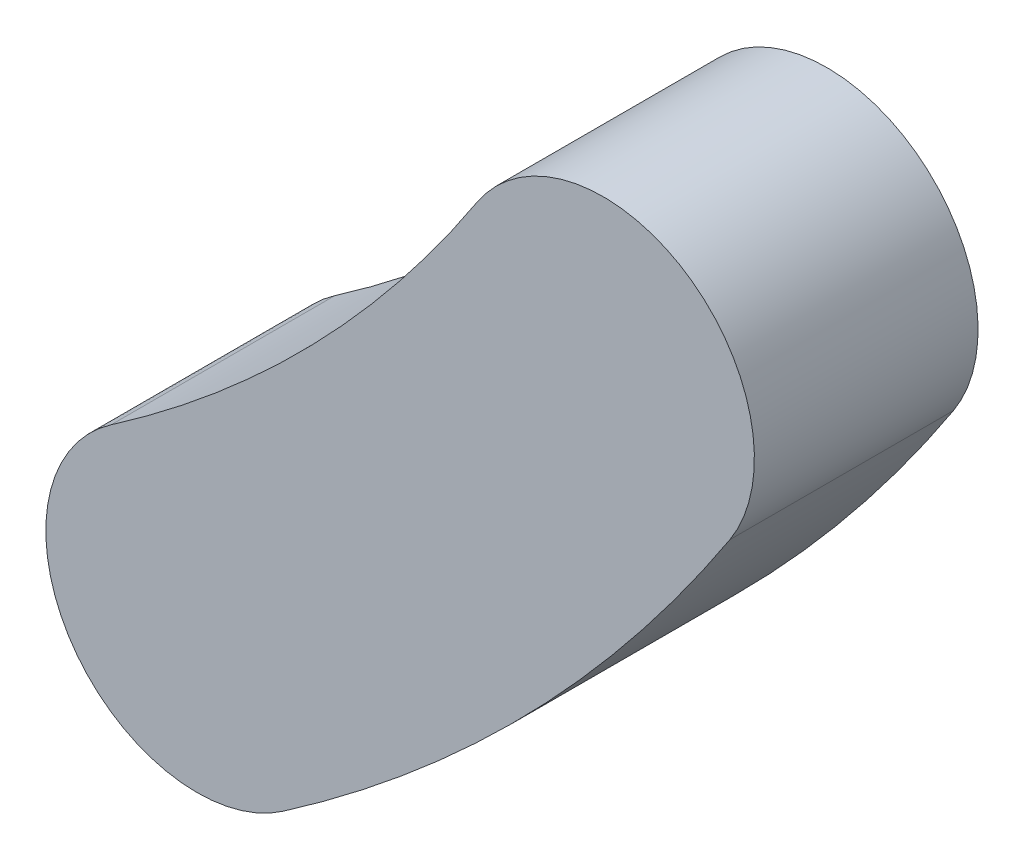
ISO-10303-21;
HEADER;
FILE_DESCRIPTION(('STEP AP214'),'2;1');
FILE_NAME('part.step','',(''),(''),'','','');
FILE_SCHEMA(('AUTOMOTIVE_DESIGN { 1 0 10303 214 1 1 1 1 }'));
ENDSEC;
DATA;
#1=APPLICATION_CONTEXT('core data for automotive mechanical design processes');
#2=APPLICATION_PROTOCOL_DEFINITION('international standard','automotive_design',2000,#1);
#3=PRODUCT_CONTEXT('',#1,'mechanical');
#4=PRODUCT('Part','Part','',(#3));
#5=PRODUCT_RELATED_PRODUCT_CATEGORY('part','',(#4));
#6=PRODUCT_DEFINITION_FORMATION('','',#4);
#7=PRODUCT_DEFINITION_CONTEXT('part definition',#1,'design');
#8=PRODUCT_DEFINITION('design','',#6,#7);
#9=PRODUCT_DEFINITION_SHAPE('','',#8);
#10=(LENGTH_UNIT() NAMED_UNIT(*) SI_UNIT(.MILLI.,.METRE.));
#11=(NAMED_UNIT(*) PLANE_ANGLE_UNIT() SI_UNIT($,.RADIAN.));
#12=(NAMED_UNIT(*) SI_UNIT($,.STERADIAN.) SOLID_ANGLE_UNIT());
#13=UNCERTAINTY_MEASURE_WITH_UNIT(LENGTH_MEASURE(1.E-05),#10,'distance_accuracy_value','');
#14=(GEOMETRIC_REPRESENTATION_CONTEXT(3) GLOBAL_UNCERTAINTY_ASSIGNED_CONTEXT((#13)) GLOBAL_UNIT_ASSIGNED_CONTEXT((#10,
#11,#12)) REPRESENTATION_CONTEXT('',''));
#15=CARTESIAN_POINT('',(0.,0.,0.));
#16=DIRECTION('',(0.,0.,1.));
#17=DIRECTION('',(1.,0.,0.));
#18=AXIS2_PLACEMENT_3D('',#15,#16,#17);
#19=CARTESIAN_POINT('',(96.5590775079883,4.43087548038594,3.));
#20=DIRECTION('',(0.,0.,-1.));
#21=DIRECTION('',(-1.,0.,0.));
#22=AXIS2_PLACEMENT_3D('',#19,#20,#21);
#23=CYLINDRICAL_SURFACE('',#22,2.02785815452427);
#24=CARTESIAN_POINT('',(96.5590775079883,4.43087548038594,0.));
#25=DIRECTION('',(0.,0.,1.));
#26=DIRECTION('',(1.,0.,0.));
#27=AXIS2_PLACEMENT_3D('',#24,#25,#26);
#28=CIRCLE('',#27,2.02785815452427);
#29=CARTESIAN_POINT('',(95.4078998484682,6.10030612916785,0.));
#30=VERTEX_POINT('',#29);
#31=CARTESIAN_POINT('',(97.7102551675084,2.76144483160403,0.));
#32=VERTEX_POINT('',#31);
#33=EDGE_CURVE('E96',#30,#32,#28,.T.);
#34=ORIENTED_EDGE('',*,*,#33,.T.);
#35=DIRECTION('',(0.,0.,-1.));
#36=VECTOR('',#35,1.);
#37=CARTESIAN_POINT('',(97.7102551675084,2.76144483160403,3.));
#38=LINE('',#37,#36);
#39=CARTESIAN_POINT('',(97.7102551675084,2.76144483160403,3.));
#40=VERTEX_POINT('',#39);
#41=EDGE_CURVE('E11',#40,#32,#38,.T.);
#42=ORIENTED_EDGE('',*,*,#41,.F.);
#43=CARTESIAN_POINT('',(96.5590775079883,4.43087548038594,3.));
#44=DIRECTION('',(0.,0.,1.));
#45=DIRECTION('',(1.,0.,0.));
#46=AXIS2_PLACEMENT_3D('',#43,#44,#45);
#47=CIRCLE('',#46,2.02785815452427);
#48=CARTESIAN_POINT('',(95.4078998484682,6.10030612916785,3.));
#49=VERTEX_POINT('',#48);
#50=EDGE_CURVE('E84',#49,#40,#47,.T.);
#51=ORIENTED_EDGE('',*,*,#50,.F.);
#52=DIRECTION('',(0.,0.,-1.));
#53=VECTOR('',#52,1.);
#54=CARTESIAN_POINT('',(95.4078998484682,6.10030612916785,3.));
#55=LINE('',#54,#53);
#56=EDGE_CURVE('E92',#49,#30,#55,.T.);
#57=ORIENTED_EDGE('',*,*,#56,.T.);
#58=EDGE_LOOP('',(#34,#42,#51,#57));
#59=FACE_BOUND('',#58,.T.);
#60=ADVANCED_FACE('F33',(#59),#23,.T.);
#61=CARTESIAN_POINT('',(85.1067875300661,21.0389148475256,3.));
#62=DIRECTION('',(0.,0.,-1.));
#63=DIRECTION('',(-1.,0.,0.));
#64=AXIS2_PLACEMENT_3D('',#61,#62,#63);
#65=CYLINDRICAL_SURFACE('',#64,22.2016509897567);
#66=CARTESIAN_POINT('',(85.1067875300661,21.0389148475256,0.));
#67=DIRECTION('',(0.,0.,1.));
#68=DIRECTION('',(1.,0.,0.));
#69=AXIS2_PLACEMENT_3D('',#66,#67,#68);
#70=CIRCLE('',#69,22.2016509897567);
#71=CARTESIAN_POINT('',(103.705299458729,8.91420203812898,0.));
#72=VERTEX_POINT('',#71);
#73=EDGE_CURVE('E88',#32,#72,#70,.T.);
#74=ORIENTED_EDGE('',*,*,#73,.T.);
#75=DIRECTION('',(0.,0.,-1.));
#76=VECTOR('',#75,1.);
#77=CARTESIAN_POINT('',(103.705299458729,8.91420203812898,3.));
#78=LINE('',#77,#76);
#79=CARTESIAN_POINT('',(103.705299458729,8.91420203812898,3.));
#80=VERTEX_POINT('',#79);
#81=EDGE_CURVE('E41',#80,#72,#78,.T.);
#82=ORIENTED_EDGE('',*,*,#81,.F.);
#83=CARTESIAN_POINT('',(85.1067875300661,21.0389148475256,3.));
#84=DIRECTION('',(0.,0.,1.));
#85=DIRECTION('',(1.,0.,0.));
#86=AXIS2_PLACEMENT_3D('',#83,#84,#85);
#87=CIRCLE('',#86,22.2016509897567);
#88=EDGE_CURVE('E79',#40,#80,#87,.T.);
#89=ORIENTED_EDGE('',*,*,#88,.F.);
#90=ORIENTED_EDGE('',*,*,#41,.T.);
#91=EDGE_LOOP('',(#74,#82,#89,#90));
#92=FACE_BOUND('',#91,.T.);
#93=ADVANCED_FACE('F87',(#92),#65,.T.);
#94=CARTESIAN_POINT('',(102.006545429402,10.0216511081618,3.));
#95=DIRECTION('',(0.,0.,-1.));
#96=DIRECTION('',(-1.,0.,0.));
#97=AXIS2_PLACEMENT_3D('',#94,#95,#96);
#98=CYLINDRICAL_SURFACE('',#97,2.02785815452426);
#99=CARTESIAN_POINT('',(102.006545429402,10.0216511081618,0.));
#100=DIRECTION('',(0.,0.,1.));
#101=DIRECTION('',(1.,0.,0.));
#102=AXIS2_PLACEMENT_3D('',#99,#100,#101);
#103=CIRCLE('',#102,2.02785815452426);
#104=CARTESIAN_POINT('',(100.307791400076,11.1291001781947,0.));
#105=VERTEX_POINT('',#104);
#106=EDGE_CURVE('E66',#72,#105,#103,.T.);
#107=ORIENTED_EDGE('',*,*,#106,.T.);
#108=DIRECTION('',(0.,0.,-1.));
#109=VECTOR('',#108,1.);
#110=CARTESIAN_POINT('',(100.307791400076,11.1291001781947,3.));
#111=LINE('',#110,#109);
#112=CARTESIAN_POINT('',(100.307791400076,11.1291001781947,3.));
#113=VERTEX_POINT('',#112);
#114=EDGE_CURVE('E89',#113,#105,#111,.T.);
#115=ORIENTED_EDGE('',*,*,#114,.F.);
#116=CARTESIAN_POINT('',(102.006545429402,10.0216511081618,3.));
#117=DIRECTION('',(0.,0.,1.));
#118=DIRECTION('',(1.,0.,0.));
#119=AXIS2_PLACEMENT_3D('',#116,#117,#118);
#120=CIRCLE('',#119,2.02785815452426);
#121=EDGE_CURVE('E82',#80,#113,#120,.T.);
#122=ORIENTED_EDGE('',*,*,#121,.F.);
#123=ORIENTED_EDGE('',*,*,#81,.T.);
#124=EDGE_LOOP('',(#107,#115,#122,#123));
#125=FACE_BOUND('',#124,.T.);
#126=ADVANCED_FACE('F90',(#125),#98,.T.);
#127=CARTESIAN_POINT('',(85.1067875300661,21.0389148475256,3.));
#128=DIRECTION('',(0.,0.,-1.));
#129=DIRECTION('',(-1.,0.,0.));
#130=AXIS2_PLACEMENT_3D('',#127,#128,#129);
#131=CYLINDRICAL_SURFACE('',#130,18.1459346807082);
#132=CARTESIAN_POINT('',(85.1067875300661,21.0389148475256,0.));
#133=DIRECTION('',(0.,0.,-1.));
#134=DIRECTION('',(1.,0.,0.));
#135=AXIS2_PLACEMENT_3D('',#132,#133,#134);
#136=CIRCLE('',#135,18.1459346807082);
#137=EDGE_CURVE('E72',#105,#30,#136,.T.);
#138=ORIENTED_EDGE('',*,*,#137,.T.);
#139=ORIENTED_EDGE('',*,*,#56,.F.);
#140=CARTESIAN_POINT('',(85.1067875300661,21.0389148475256,3.));
#141=DIRECTION('',(0.,0.,-1.));
#142=DIRECTION('',(1.,0.,0.));
#143=AXIS2_PLACEMENT_3D('',#140,#141,#142);
#144=CIRCLE('',#143,18.1459346807082);
#145=EDGE_CURVE('E49',#113,#49,#144,.T.);
#146=ORIENTED_EDGE('',*,*,#145,.F.);
#147=ORIENTED_EDGE('',*,*,#114,.T.);
#148=EDGE_LOOP('',(#138,#139,#146,#147));
#149=FACE_BOUND('',#148,.T.);
#150=ADVANCED_FACE('F103',(#149),#131,.F.);
#151=CARTESIAN_POINT('',(90.8329325190272,12.7348951639558,3.));
#152=DIRECTION('',(0.,0.,1.));
#153=DIRECTION('',(1.,0.,0.));
#154=AXIS2_PLACEMENT_3D('',#151,#152,#153);
#155=PLANE('',#154);
#156=ORIENTED_EDGE('',*,*,#50,.T.);
#157=ORIENTED_EDGE('',*,*,#88,.T.);
#158=ORIENTED_EDGE('',*,*,#121,.T.);
#159=ORIENTED_EDGE('',*,*,#145,.T.);
#160=EDGE_LOOP('',(#156,#157,#158,#159));
#161=FACE_BOUND('',#160,.T.);
#162=ADVANCED_FACE('F80',(#161),#155,.T.);
#163=CARTESIAN_POINT('',(90.8329325190272,12.7348951639558,0.));
#164=DIRECTION('',(0.,0.,1.));
#165=DIRECTION('',(1.,0.,0.));
#166=AXIS2_PLACEMENT_3D('',#163,#164,#165);
#167=PLANE('',#166);
#168=ORIENTED_EDGE('',*,*,#33,.F.);
#169=ORIENTED_EDGE('',*,*,#137,.F.);
#170=ORIENTED_EDGE('',*,*,#106,.F.);
#171=ORIENTED_EDGE('',*,*,#73,.F.);
#172=EDGE_LOOP('',(#168,#169,#170,#171));
#173=FACE_BOUND('',#172,.T.);
#174=ADVANCED_FACE('F106',(#173),#167,.F.);
#175=CLOSED_SHELL('',(#60,#93,#126,#150,#162,#174));
#176=MANIFOLD_SOLID_BREP('B2',#175);
#177=ADVANCED_BREP_SHAPE_REPRESENTATION('',(#18,#176),#14);
#178=SHAPE_DEFINITION_REPRESENTATION(#9,#177);
ENDSEC;
END-ISO-10303-21;
